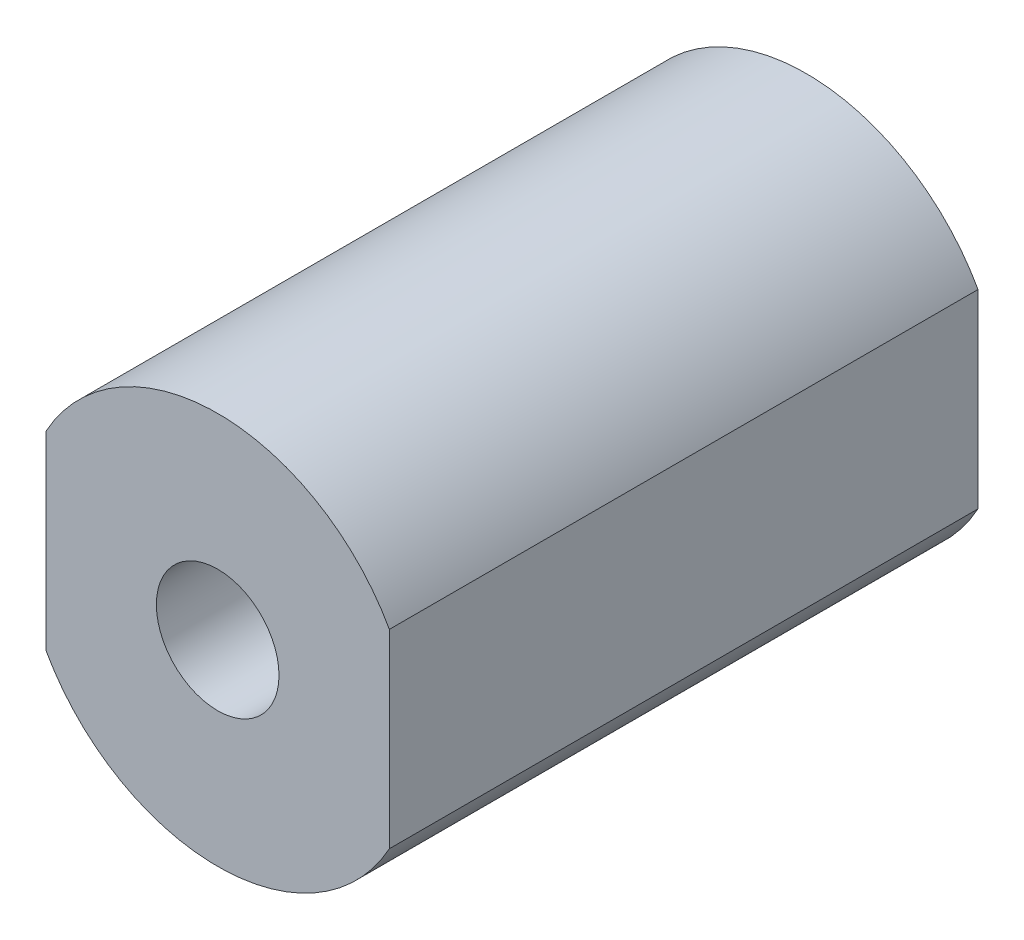
ISO-10303-21;
HEADER;
FILE_DESCRIPTION(('STEP AP214'),'2;1');
FILE_NAME('part.step','',(''),(''),'','','');
FILE_SCHEMA(('AUTOMOTIVE_DESIGN { 1 0 10303 214 1 1 1 1 }'));
ENDSEC;
DATA;
#1=APPLICATION_CONTEXT('core data for automotive mechanical design processes');
#2=APPLICATION_PROTOCOL_DEFINITION('international standard','automotive_design',2000,#1);
#3=PRODUCT_CONTEXT('',#1,'mechanical');
#4=PRODUCT('Part','Part','',(#3));
#5=PRODUCT_RELATED_PRODUCT_CATEGORY('part','',(#4));
#6=PRODUCT_DEFINITION_FORMATION('','',#4);
#7=PRODUCT_DEFINITION_CONTEXT('part definition',#1,'design');
#8=PRODUCT_DEFINITION('design','',#6,#7);
#9=PRODUCT_DEFINITION_SHAPE('','',#8);
#10=(LENGTH_UNIT() NAMED_UNIT(*) SI_UNIT(.MILLI.,.METRE.));
#11=(NAMED_UNIT(*) PLANE_ANGLE_UNIT() SI_UNIT($,.RADIAN.));
#12=(NAMED_UNIT(*) SI_UNIT($,.STERADIAN.) SOLID_ANGLE_UNIT());
#13=UNCERTAINTY_MEASURE_WITH_UNIT(LENGTH_MEASURE(1.E-05),#10,'distance_accuracy_value','');
#14=(GEOMETRIC_REPRESENTATION_CONTEXT(3) GLOBAL_UNCERTAINTY_ASSIGNED_CONTEXT((#13)) GLOBAL_UNIT_ASSIGNED_CONTEXT((#10,
#11,#12)) REPRESENTATION_CONTEXT('',''));
#15=CARTESIAN_POINT('',(0.,0.,0.));
#16=DIRECTION('',(0.,0.,1.));
#17=DIRECTION('',(1.,0.,0.));
#18=AXIS2_PLACEMENT_3D('',#15,#16,#17);
#19=CARTESIAN_POINT('',(0.,0.,12.));
#20=DIRECTION('',(0.,0.,-1.));
#21=DIRECTION('',(-1.,0.,0.));
#22=AXIS2_PLACEMENT_3D('',#19,#20,#21);
#23=CYLINDRICAL_SURFACE('',#22,1.25);
#24=CARTESIAN_POINT('',(0.,0.,12.));
#25=DIRECTION('',(0.,0.,1.));
#26=DIRECTION('',(1.,0.,0.));
#27=AXIS2_PLACEMENT_3D('',#24,#25,#26);
#28=CIRCLE('',#27,1.25);
#29=CARTESIAN_POINT('',(1.25,0.,12.));
#30=VERTEX_POINT('',#29);
#31=EDGE_CURVE('E101',#30,#30,#28,.T.);
#32=ORIENTED_EDGE('',*,*,#31,.T.);
#33=EDGE_LOOP('',(#32));
#34=FACE_BOUND('',#33,.T.);
#35=CARTESIAN_POINT('',(0.,0.,0.3));
#36=DIRECTION('',(0.,0.,-1.));
#37=DIRECTION('',(-1.,0.,0.));
#38=AXIS2_PLACEMENT_3D('',#35,#36,#37);
#39=CIRCLE('',#38,1.25);
#40=CARTESIAN_POINT('',(-1.25,0.,0.3));
#41=VERTEX_POINT('',#40);
#42=EDGE_CURVE('E114',#41,#41,#39,.T.);
#43=ORIENTED_EDGE('',*,*,#42,.T.);
#44=EDGE_LOOP('',(#43));
#45=FACE_BOUND('',#44,.T.);
#46=ADVANCED_FACE('F33',(#34,#45),#23,.F.);
#47=CARTESIAN_POINT('',(0.,0.,12.));
#48=DIRECTION('',(0.,0.,1.));
#49=DIRECTION('',(1.,0.,0.));
#50=AXIS2_PLACEMENT_3D('',#47,#48,#49);
#51=PLANE('',#50);
#52=CARTESIAN_POINT('',(0.,0.,12.));
#53=DIRECTION('',(0.,0.,1.));
#54=DIRECTION('',(1.,0.,0.));
#55=AXIS2_PLACEMENT_3D('',#52,#53,#54);
#56=CIRCLE('',#55,4.);
#57=CARTESIAN_POINT('',(-3.5,-1.93649167310371,12.));
#58=VERTEX_POINT('',#57);
#59=CARTESIAN_POINT('',(3.5,-1.93649167310371,12.));
#60=VERTEX_POINT('',#59);
#61=EDGE_CURVE('E86',#58,#60,#56,.T.);
#62=ORIENTED_EDGE('',*,*,#61,.T.);
#63=DIRECTION('',(0.,1.,0.));
#64=VECTOR('',#63,1.);
#65=CARTESIAN_POINT('',(3.5,1.93649167310371,12.));
#66=LINE('',#65,#64);
#67=CARTESIAN_POINT('',(3.5,1.93649167310371,12.));
#68=VERTEX_POINT('',#67);
#69=EDGE_CURVE('E80',#60,#68,#66,.T.);
#70=ORIENTED_EDGE('',*,*,#69,.T.);
#71=CARTESIAN_POINT('',(0.,0.,12.));
#72=DIRECTION('',(0.,0.,1.));
#73=DIRECTION('',(1.,0.,0.));
#74=AXIS2_PLACEMENT_3D('',#71,#72,#73);
#75=CIRCLE('',#74,4.);
#76=CARTESIAN_POINT('',(-3.5,1.93649167310371,12.));
#77=VERTEX_POINT('',#76);
#78=EDGE_CURVE('E84',#68,#77,#75,.T.);
#79=ORIENTED_EDGE('',*,*,#78,.T.);
#80=DIRECTION('',(0.,-1.,0.));
#81=VECTOR('',#80,1.);
#82=CARTESIAN_POINT('',(-3.5,1.93649167310371,12.));
#83=LINE('',#82,#81);
#84=EDGE_CURVE('E50',#77,#58,#83,.T.);
#85=ORIENTED_EDGE('',*,*,#84,.T.);
#86=EDGE_LOOP('',(#62,#70,#79,#85));
#87=FACE_BOUND('',#86,.T.);
#88=ORIENTED_EDGE('',*,*,#31,.F.);
#89=EDGE_LOOP('',(#88));
#90=FACE_BOUND('',#89,.T.);
#91=ADVANCED_FACE('F81',(#87,#90),#51,.T.);
#92=CARTESIAN_POINT('',(0.,0.,0.));
#93=DIRECTION('',(0.,0.,1.));
#94=DIRECTION('',(1.,0.,0.));
#95=AXIS2_PLACEMENT_3D('',#92,#93,#94);
#96=PLANE('',#95);
#97=CARTESIAN_POINT('',(0.,0.,0.));
#98=DIRECTION('',(0.,0.,1.));
#99=DIRECTION('',(1.,0.,0.));
#100=AXIS2_PLACEMENT_3D('',#97,#98,#99);
#101=CIRCLE('',#100,4.);
#102=CARTESIAN_POINT('',(-3.5,-1.93649167310371,0.));
#103=VERTEX_POINT('',#102);
#104=CARTESIAN_POINT('',(3.5,-1.93649167310371,0.));
#105=VERTEX_POINT('',#104);
#106=EDGE_CURVE('E98',#103,#105,#101,.T.);
#107=ORIENTED_EDGE('',*,*,#106,.F.);
#108=DIRECTION('',(0.,-1.,0.));
#109=VECTOR('',#108,1.);
#110=CARTESIAN_POINT('',(-3.5,1.93649167310371,0.));
#111=LINE('',#110,#109);
#112=CARTESIAN_POINT('',(-3.5,1.93649167310371,0.));
#113=VERTEX_POINT('',#112);
#114=EDGE_CURVE('E73',#113,#103,#111,.T.);
#115=ORIENTED_EDGE('',*,*,#114,.F.);
#116=CARTESIAN_POINT('',(0.,0.,0.));
#117=DIRECTION('',(0.,0.,1.));
#118=DIRECTION('',(1.,0.,0.));
#119=AXIS2_PLACEMENT_3D('',#116,#117,#118);
#120=CIRCLE('',#119,4.);
#121=CARTESIAN_POINT('',(3.5,1.93649167310371,0.));
#122=VERTEX_POINT('',#121);
#123=EDGE_CURVE('E67',#122,#113,#120,.T.);
#124=ORIENTED_EDGE('',*,*,#123,.F.);
#125=DIRECTION('',(0.,1.,0.));
#126=VECTOR('',#125,1.);
#127=CARTESIAN_POINT('',(3.5,1.93649167310371,0.));
#128=LINE('',#127,#126);
#129=EDGE_CURVE('E90',#105,#122,#128,.T.);
#130=ORIENTED_EDGE('',*,*,#129,.F.);
#131=EDGE_LOOP('',(#107,#115,#124,#130));
#132=FACE_BOUND('',#131,.T.);
#133=ADVANCED_FACE('F109',(#132),#96,.F.);
#134=CARTESIAN_POINT('',(0.,0.,12.));
#135=DIRECTION('',(0.,0.,-1.));
#136=DIRECTION('',(-1.,0.,0.));
#137=AXIS2_PLACEMENT_3D('',#134,#135,#136);
#138=CYLINDRICAL_SURFACE('',#137,4.);
#139=ORIENTED_EDGE('',*,*,#106,.T.);
#140=DIRECTION('',(0.,0.,-1.));
#141=VECTOR('',#140,1.);
#142=CARTESIAN_POINT('',(3.5,-1.93649167310371,12.));
#143=LINE('',#142,#141);
#144=EDGE_CURVE('E11',#60,#105,#143,.T.);
#145=ORIENTED_EDGE('',*,*,#144,.F.);
#146=ORIENTED_EDGE('',*,*,#61,.F.);
#147=DIRECTION('',(0.,0.,-1.));
#148=VECTOR('',#147,1.);
#149=CARTESIAN_POINT('',(-3.5,-1.93649167310371,12.));
#150=LINE('',#149,#148);
#151=EDGE_CURVE('E94',#58,#103,#150,.T.);
#152=ORIENTED_EDGE('',*,*,#151,.T.);
#153=EDGE_LOOP('',(#139,#145,#146,#152));
#154=FACE_BOUND('',#153,.T.);
#155=ADVANCED_FACE('F35',(#154),#138,.T.);
#156=CARTESIAN_POINT('',(3.5,1.93649167310371,12.));
#157=DIRECTION('',(-1.,0.,0.));
#158=DIRECTION('',(0.,-1.,0.));
#159=AXIS2_PLACEMENT_3D('',#156,#157,#158);
#160=PLANE('',#159);
#161=ORIENTED_EDGE('',*,*,#129,.T.);
#162=DIRECTION('',(0.,0.,-1.));
#163=VECTOR('',#162,1.);
#164=CARTESIAN_POINT('',(3.5,1.93649167310371,12.));
#165=LINE('',#164,#163);
#166=EDGE_CURVE('E42',#68,#122,#165,.T.);
#167=ORIENTED_EDGE('',*,*,#166,.F.);
#168=ORIENTED_EDGE('',*,*,#69,.F.);
#169=ORIENTED_EDGE('',*,*,#144,.T.);
#170=EDGE_LOOP('',(#161,#167,#168,#169));
#171=FACE_BOUND('',#170,.T.);
#172=ADVANCED_FACE('F89',(#171),#160,.F.);
#173=CARTESIAN_POINT('',(0.,0.,12.));
#174=DIRECTION('',(0.,0.,-1.));
#175=DIRECTION('',(-1.,0.,0.));
#176=AXIS2_PLACEMENT_3D('',#173,#174,#175);
#177=CYLINDRICAL_SURFACE('',#176,4.);
#178=ORIENTED_EDGE('',*,*,#123,.T.);
#179=DIRECTION('',(0.,0.,-1.));
#180=VECTOR('',#179,1.);
#181=CARTESIAN_POINT('',(-3.5,1.93649167310371,12.));
#182=LINE('',#181,#180);
#183=EDGE_CURVE('E91',#77,#113,#182,.T.);
#184=ORIENTED_EDGE('',*,*,#183,.F.);
#185=ORIENTED_EDGE('',*,*,#78,.F.);
#186=ORIENTED_EDGE('',*,*,#166,.T.);
#187=EDGE_LOOP('',(#178,#184,#185,#186));
#188=FACE_BOUND('',#187,.T.);
#189=ADVANCED_FACE('F92',(#188),#177,.T.);
#190=CARTESIAN_POINT('',(-3.5,1.93649167310371,12.));
#191=DIRECTION('',(1.,0.,0.));
#192=DIRECTION('',(0.,1.,0.));
#193=AXIS2_PLACEMENT_3D('',#190,#191,#192);
#194=PLANE('',#193);
#195=ORIENTED_EDGE('',*,*,#114,.T.);
#196=ORIENTED_EDGE('',*,*,#151,.F.);
#197=ORIENTED_EDGE('',*,*,#84,.F.);
#198=ORIENTED_EDGE('',*,*,#183,.T.);
#199=EDGE_LOOP('',(#195,#196,#197,#198));
#200=FACE_BOUND('',#199,.T.);
#201=ADVANCED_FACE('F106',(#200),#194,.F.);
#202=CARTESIAN_POINT('',(0.,0.,0.3));
#203=DIRECTION('',(0.,0.,-1.));
#204=DIRECTION('',(-1.,0.,0.));
#205=AXIS2_PLACEMENT_3D('',#202,#203,#204);
#206=PLANE('',#205);
#207=ORIENTED_EDGE('',*,*,#42,.F.);
#208=EDGE_LOOP('',(#207));
#209=FACE_BOUND('',#208,.T.);
#210=ADVANCED_FACE('F119',(#209),#206,.F.);
#211=CLOSED_SHELL('',(#46,#91,#133,#155,#172,#189,#201,#210));
#212=MANIFOLD_SOLID_BREP('B2',#211);
#213=ADVANCED_BREP_SHAPE_REPRESENTATION('',(#18,#212),#14);
#214=SHAPE_DEFINITION_REPRESENTATION(#9,#213);
ENDSEC;
END-ISO-10303-21;
